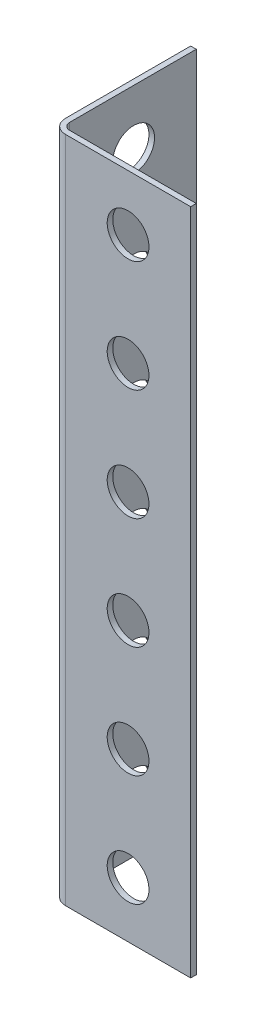
ISO-10303-21;
HEADER;
FILE_DESCRIPTION(('STEP AP214'),'2;1');
FILE_NAME('part.step','',(''),(''),'','','');
FILE_SCHEMA(('AUTOMOTIVE_DESIGN { 1 0 10303 214 1 1 1 1 }'));
ENDSEC;
DATA;
#1=APPLICATION_CONTEXT('core data for automotive mechanical design processes');
#2=APPLICATION_PROTOCOL_DEFINITION('international standard','automotive_design',2000,#1);
#3=PRODUCT_CONTEXT('',#1,'mechanical');
#4=PRODUCT('Part','Part','',(#3));
#5=PRODUCT_RELATED_PRODUCT_CATEGORY('part','',(#4));
#6=PRODUCT_DEFINITION_FORMATION('','',#4);
#7=PRODUCT_DEFINITION_CONTEXT('part definition',#1,'design');
#8=PRODUCT_DEFINITION('design','',#6,#7);
#9=PRODUCT_DEFINITION_SHAPE('','',#8);
#10=(LENGTH_UNIT() NAMED_UNIT(*) SI_UNIT(.MILLI.,.METRE.));
#11=(NAMED_UNIT(*) PLANE_ANGLE_UNIT() SI_UNIT($,.RADIAN.));
#12=(NAMED_UNIT(*) SI_UNIT($,.STERADIAN.) SOLID_ANGLE_UNIT());
#13=UNCERTAINTY_MEASURE_WITH_UNIT(LENGTH_MEASURE(1.E-05),#10,'distance_accuracy_value','');
#14=(GEOMETRIC_REPRESENTATION_CONTEXT(3) GLOBAL_UNCERTAINTY_ASSIGNED_CONTEXT((#13)) GLOBAL_UNIT_ASSIGNED_CONTEXT((#10,
#11,#12)) REPRESENTATION_CONTEXT('',''));
#15=CARTESIAN_POINT('',(0.,0.,0.));
#16=DIRECTION('',(0.,0.,1.));
#17=DIRECTION('',(1.,0.,0.));
#18=AXIS2_PLACEMENT_3D('',#15,#16,#17);
#19=CARTESIAN_POINT('',(0.,1219.2,-1.27));
#20=DIRECTION('',(0.,0.,-1.));
#21=DIRECTION('',(-1.,0.,0.));
#22=AXIS2_PLACEMENT_3D('',#19,#20,#21);
#23=PLANE('',#22);
#24=CARTESIAN_POINT('',(17.4625000000112,139.700000000001,-1.27));
#25=DIRECTION('',(0.,0.,-1.));
#26=DIRECTION('',(-1.,0.,0.));
#27=AXIS2_PLACEMENT_3D('',#24,#25,#26);
#28=CIRCLE('',#27,4.76250000000003);
#29=CARTESIAN_POINT('',(12.7000000000111,139.700000000001,-1.27));
#30=VERTEX_POINT('',#29);
#31=EDGE_CURVE('E176',#30,#30,#28,.F.);
#32=ORIENTED_EDGE('',*,*,#31,.T.);
#33=EDGE_LOOP('',(#32));
#34=FACE_BOUND('',#33,.T.);
#35=CARTESIAN_POINT('',(17.4625000000114,114.300000000001,-1.27));
#36=DIRECTION('',(0.,0.,-1.));
#37=DIRECTION('',(-1.,0.,0.));
#38=AXIS2_PLACEMENT_3D('',#35,#36,#37);
#39=CIRCLE('',#38,4.76250000000003);
#40=CARTESIAN_POINT('',(12.7000000000114,114.300000000001,-1.27));
#41=VERTEX_POINT('',#40);
#42=EDGE_CURVE('E170',#41,#41,#39,.F.);
#43=ORIENTED_EDGE('',*,*,#42,.T.);
#44=EDGE_LOOP('',(#43));
#45=FACE_BOUND('',#44,.T.);
#46=CARTESIAN_POINT('',(17.4625000000117,88.9000000000011,-1.27));
#47=DIRECTION('',(0.,0.,-1.));
#48=DIRECTION('',(-1.,0.,0.));
#49=AXIS2_PLACEMENT_3D('',#46,#47,#48);
#50=CIRCLE('',#49,4.76250000000003);
#51=CARTESIAN_POINT('',(12.7000000000117,88.9000000000011,-1.27));
#52=VERTEX_POINT('',#51);
#53=EDGE_CURVE('E164',#52,#52,#50,.F.);
#54=ORIENTED_EDGE('',*,*,#53,.T.);
#55=EDGE_LOOP('',(#54));
#56=FACE_BOUND('',#55,.T.);
#57=CARTESIAN_POINT('',(17.462500000012,63.5000000000012,-1.27));
#58=DIRECTION('',(0.,0.,-1.));
#59=DIRECTION('',(-1.,0.,0.));
#60=AXIS2_PLACEMENT_3D('',#57,#58,#59);
#61=CIRCLE('',#60,4.76250000000003);
#62=CARTESIAN_POINT('',(12.7000000000119,63.5000000000012,-1.27));
#63=VERTEX_POINT('',#62);
#64=EDGE_CURVE('E158',#63,#63,#61,.F.);
#65=ORIENTED_EDGE('',*,*,#64,.T.);
#66=EDGE_LOOP('',(#65));
#67=FACE_BOUND('',#66,.T.);
#68=CARTESIAN_POINT('',(17.4625000000122,38.1000000000011,-1.27));
#69=DIRECTION('',(0.,0.,-1.));
#70=DIRECTION('',(-1.,0.,0.));
#71=AXIS2_PLACEMENT_3D('',#68,#69,#70);
#72=CIRCLE('',#71,4.76250000000003);
#73=CARTESIAN_POINT('',(12.7000000000122,38.1000000000011,-1.27));
#74=VERTEX_POINT('',#73);
#75=EDGE_CURVE('E152',#74,#74,#72,.F.);
#76=ORIENTED_EDGE('',*,*,#75,.T.);
#77=EDGE_LOOP('',(#76));
#78=FACE_BOUND('',#77,.T.);
#79=CARTESIAN_POINT('',(17.4625000000125,12.700000000001,-1.27));
#80=DIRECTION('',(0.,0.,-1.));
#81=DIRECTION('',(-1.,0.,0.));
#82=AXIS2_PLACEMENT_3D('',#79,#80,#81);
#83=CIRCLE('',#82,4.76250000000003);
#84=CARTESIAN_POINT('',(12.7000000000125,12.700000000001,-1.27));
#85=VERTEX_POINT('',#84);
#86=EDGE_CURVE('E143',#85,#85,#83,.F.);
#87=ORIENTED_EDGE('',*,*,#86,.T.);
#88=EDGE_LOOP('',(#87));
#89=FACE_BOUND('',#88,.T.);
#90=DIRECTION('',(0.,-1.,0.));
#91=VECTOR('',#90,1.);
#92=CARTESIAN_POINT('',(2.8575,1219.2,-1.27));
#93=LINE('',#92,#91);
#94=CARTESIAN_POINT('',(2.8575,0.,-1.27));
#95=VERTEX_POINT('',#94);
#96=CARTESIAN_POINT('',(2.8575,152.4,-1.27));
#97=VERTEX_POINT('',#96);
#98=EDGE_CURVE('E40',#95,#97,#93,.F.);
#99=ORIENTED_EDGE('',*,*,#98,.T.);
#100=DIRECTION('',(-1.,0.,0.));
#101=VECTOR('',#100,1.);
#102=CARTESIAN_POINT('',(31.75,152.4,-1.27));
#103=LINE('',#102,#101);
#104=CARTESIAN_POINT('',(31.75,152.4,-1.27));
#105=VERTEX_POINT('',#104);
#106=EDGE_CURVE('E47',#105,#97,#103,.T.);
#107=ORIENTED_EDGE('',*,*,#106,.F.);
#108=DIRECTION('',(0.,-1.,0.));
#109=VECTOR('',#108,1.);
#110=CARTESIAN_POINT('',(31.75,1219.2,-1.27));
#111=LINE('',#110,#109);
#112=CARTESIAN_POINT('',(31.75,0.,-1.27));
#113=VERTEX_POINT('',#112);
#114=EDGE_CURVE('E125',#105,#113,#111,.T.);
#115=ORIENTED_EDGE('',*,*,#114,.T.);
#116=DIRECTION('',(1.,0.,0.));
#117=VECTOR('',#116,1.);
#118=CARTESIAN_POINT('',(0.,0.,-1.27));
#119=LINE('',#118,#117);
#120=EDGE_CURVE('E138',#95,#113,#119,.T.);
#121=ORIENTED_EDGE('',*,*,#120,.F.);
#122=EDGE_LOOP('',(#99,#107,#115,#121));
#123=FACE_BOUND('',#122,.T.);
#124=ADVANCED_FACE('F32',(#34,#45,#56,#67,#78,#89,#123),#23,.T.);
#125=CARTESIAN_POINT('',(1.27,1219.2,0.));
#126=DIRECTION('',(-1.,0.,0.));
#127=DIRECTION('',(0.,0.,1.));
#128=AXIS2_PLACEMENT_3D('',#125,#126,#127);
#129=PLANE('',#128);
#130=CARTESIAN_POINT('',(1.27,12.7,-17.4625));
#131=DIRECTION('',(-1.,0.,0.));
#132=DIRECTION('',(0.,0.,1.));
#133=AXIS2_PLACEMENT_3D('',#130,#131,#132);
#134=CIRCLE('',#133,4.7625);
#135=CARTESIAN_POINT('',(1.27,12.7,-12.7));
#136=VERTEX_POINT('',#135);
#137=EDGE_CURVE('E217',#136,#136,#134,.F.);
#138=ORIENTED_EDGE('',*,*,#137,.F.);
#139=EDGE_LOOP('',(#138));
#140=FACE_BOUND('',#139,.T.);
#141=CARTESIAN_POINT('',(1.27,38.1,-17.4625000000001));
#142=DIRECTION('',(-1.,0.,0.));
#143=DIRECTION('',(0.,0.,1.));
#144=AXIS2_PLACEMENT_3D('',#141,#142,#143);
#145=CIRCLE('',#144,4.7625);
#146=CARTESIAN_POINT('',(1.27,38.1,-12.7000000000001));
#147=VERTEX_POINT('',#146);
#148=EDGE_CURVE('E211',#147,#147,#145,.F.);
#149=ORIENTED_EDGE('',*,*,#148,.F.);
#150=EDGE_LOOP('',(#149));
#151=FACE_BOUND('',#150,.T.);
#152=CARTESIAN_POINT('',(1.27,63.5,-17.4625000000002));
#153=DIRECTION('',(-1.,0.,0.));
#154=DIRECTION('',(0.,0.,1.));
#155=AXIS2_PLACEMENT_3D('',#152,#153,#154);
#156=CIRCLE('',#155,4.7625);
#157=CARTESIAN_POINT('',(1.27,63.5,-12.7000000000002));
#158=VERTEX_POINT('',#157);
#159=EDGE_CURVE('E205',#158,#158,#156,.F.);
#160=ORIENTED_EDGE('',*,*,#159,.F.);
#161=EDGE_LOOP('',(#160));
#162=FACE_BOUND('',#161,.T.);
#163=CARTESIAN_POINT('',(1.27,88.9,-17.4625000000003));
#164=DIRECTION('',(-1.,0.,0.));
#165=DIRECTION('',(0.,0.,1.));
#166=AXIS2_PLACEMENT_3D('',#163,#164,#165);
#167=CIRCLE('',#166,4.7625);
#168=CARTESIAN_POINT('',(1.27,88.9,-12.7000000000003));
#169=VERTEX_POINT('',#168);
#170=EDGE_CURVE('E199',#169,#169,#167,.F.);
#171=ORIENTED_EDGE('',*,*,#170,.F.);
#172=EDGE_LOOP('',(#171));
#173=FACE_BOUND('',#172,.T.);
#174=CARTESIAN_POINT('',(1.27,114.3,-17.4625000000004));
#175=DIRECTION('',(-1.,0.,0.));
#176=DIRECTION('',(0.,0.,1.));
#177=AXIS2_PLACEMENT_3D('',#174,#175,#176);
#178=CIRCLE('',#177,4.7625);
#179=CARTESIAN_POINT('',(1.27,114.3,-12.7000000000003));
#180=VERTEX_POINT('',#179);
#181=EDGE_CURVE('E193',#180,#180,#178,.F.);
#182=ORIENTED_EDGE('',*,*,#181,.F.);
#183=EDGE_LOOP('',(#182));
#184=FACE_BOUND('',#183,.T.);
#185=CARTESIAN_POINT('',(1.27,139.7,-17.4625000000004));
#186=DIRECTION('',(-1.,0.,0.));
#187=DIRECTION('',(0.,0.,1.));
#188=AXIS2_PLACEMENT_3D('',#185,#186,#187);
#189=CIRCLE('',#188,4.7625);
#190=CARTESIAN_POINT('',(1.27,139.7,-12.7000000000004));
#191=VERTEX_POINT('',#190);
#192=EDGE_CURVE('E187',#191,#191,#189,.F.);
#193=ORIENTED_EDGE('',*,*,#192,.F.);
#194=EDGE_LOOP('',(#193));
#195=FACE_BOUND('',#194,.T.);
#196=DIRECTION('',(0.,0.,-1.));
#197=VECTOR('',#196,1.);
#198=CARTESIAN_POINT('',(1.27,152.4,-2.8575));
#199=LINE('',#198,#197);
#200=CARTESIAN_POINT('',(1.27,152.4,-2.8575));
#201=VERTEX_POINT('',#200);
#202=CARTESIAN_POINT('',(1.27,152.4,-31.75));
#203=VERTEX_POINT('',#202);
#204=EDGE_CURVE('E101',#201,#203,#199,.T.);
#205=ORIENTED_EDGE('',*,*,#204,.F.);
#206=DIRECTION('',(0.,-1.,0.));
#207=VECTOR('',#206,1.);
#208=CARTESIAN_POINT('',(1.27,1219.2,-2.8575));
#209=LINE('',#208,#207);
#210=CARTESIAN_POINT('',(1.27,0.,-2.8575));
#211=VERTEX_POINT('',#210);
#212=EDGE_CURVE('E133',#201,#211,#209,.T.);
#213=ORIENTED_EDGE('',*,*,#212,.T.);
#214=DIRECTION('',(0.,0.,-1.));
#215=VECTOR('',#214,1.);
#216=CARTESIAN_POINT('',(1.27,0.,0.));
#217=LINE('',#216,#215);
#218=CARTESIAN_POINT('',(1.27,0.,-31.75));
#219=VERTEX_POINT('',#218);
#220=EDGE_CURVE('E221',#211,#219,#217,.T.);
#221=ORIENTED_EDGE('',*,*,#220,.T.);
#222=DIRECTION('',(0.,-1.,0.));
#223=VECTOR('',#222,1.);
#224=CARTESIAN_POINT('',(1.27,1219.2,-31.75));
#225=LINE('',#224,#223);
#226=EDGE_CURVE('E120',#203,#219,#225,.T.);
#227=ORIENTED_EDGE('',*,*,#226,.F.);
#228=EDGE_LOOP('',(#205,#213,#221,#227));
#229=FACE_BOUND('',#228,.T.);
#230=ADVANCED_FACE('F257',(#140,#151,#162,#173,#184,#195,#229),#129,.F.);
#231=CARTESIAN_POINT('',(0.,1219.2,-31.75));
#232=DIRECTION('',(0.,0.,-1.));
#233=DIRECTION('',(-1.,0.,0.));
#234=AXIS2_PLACEMENT_3D('',#231,#232,#233);
#235=PLANE('',#234);
#236=DIRECTION('',(0.,-1.,0.));
#237=VECTOR('',#236,1.);
#238=CARTESIAN_POINT('',(0.,1219.2,-31.75));
#239=LINE('',#238,#237);
#240=CARTESIAN_POINT('',(0.,152.4,-31.75));
#241=VERTEX_POINT('',#240);
#242=CARTESIAN_POINT('',(0.,0.,-31.75));
#243=VERTEX_POINT('',#242);
#244=EDGE_CURVE('E110',#241,#243,#239,.T.);
#245=ORIENTED_EDGE('',*,*,#244,.F.);
#246=DIRECTION('',(-1.,0.,0.));
#247=VECTOR('',#246,1.);
#248=CARTESIAN_POINT('',(1.27,152.4,-31.75));
#249=LINE('',#248,#247);
#250=EDGE_CURVE('E95',#203,#241,#249,.T.);
#251=ORIENTED_EDGE('',*,*,#250,.F.);
#252=ORIENTED_EDGE('',*,*,#226,.T.);
#253=DIRECTION('',(1.,0.,0.));
#254=VECTOR('',#253,1.);
#255=CARTESIAN_POINT('',(0.,0.,-31.75));
#256=LINE('',#255,#254);
#257=EDGE_CURVE('E119',#243,#219,#256,.T.);
#258=ORIENTED_EDGE('',*,*,#257,.F.);
#259=EDGE_LOOP('',(#245,#251,#252,#258));
#260=FACE_BOUND('',#259,.T.);
#261=ADVANCED_FACE('F117',(#260),#235,.T.);
#262=CARTESIAN_POINT('',(0.,1219.2,0.));
#263=DIRECTION('',(-1.,0.,0.));
#264=DIRECTION('',(0.,0.,1.));
#265=AXIS2_PLACEMENT_3D('',#262,#263,#264);
#266=PLANE('',#265);
#267=CARTESIAN_POINT('',(0.,12.7,-17.4625));
#268=DIRECTION('',(-1.,0.,0.));
#269=DIRECTION('',(0.,0.,1.));
#270=AXIS2_PLACEMENT_3D('',#267,#268,#269);
#271=CIRCLE('',#270,4.7625);
#272=CARTESIAN_POINT('',(0.,12.7,-12.7));
#273=VERTEX_POINT('',#272);
#274=EDGE_CURVE('E214',#273,#273,#271,.T.);
#275=ORIENTED_EDGE('',*,*,#274,.F.);
#276=EDGE_LOOP('',(#275));
#277=FACE_BOUND('',#276,.T.);
#278=CARTESIAN_POINT('',(0.,38.1,-17.4625000000001));
#279=DIRECTION('',(-1.,0.,0.));
#280=DIRECTION('',(0.,0.,1.));
#281=AXIS2_PLACEMENT_3D('',#278,#279,#280);
#282=CIRCLE('',#281,4.7625);
#283=CARTESIAN_POINT('',(0.,38.1,-12.7000000000001));
#284=VERTEX_POINT('',#283);
#285=EDGE_CURVE('E208',#284,#284,#282,.T.);
#286=ORIENTED_EDGE('',*,*,#285,.F.);
#287=EDGE_LOOP('',(#286));
#288=FACE_BOUND('',#287,.T.);
#289=CARTESIAN_POINT('',(0.,63.5,-17.4625000000002));
#290=DIRECTION('',(-1.,0.,0.));
#291=DIRECTION('',(0.,0.,1.));
#292=AXIS2_PLACEMENT_3D('',#289,#290,#291);
#293=CIRCLE('',#292,4.7625);
#294=CARTESIAN_POINT('',(0.,63.5,-12.7000000000002));
#295=VERTEX_POINT('',#294);
#296=EDGE_CURVE('E202',#295,#295,#293,.T.);
#297=ORIENTED_EDGE('',*,*,#296,.F.);
#298=EDGE_LOOP('',(#297));
#299=FACE_BOUND('',#298,.T.);
#300=CARTESIAN_POINT('',(0.,88.9,-17.4625000000003));
#301=DIRECTION('',(-1.,0.,0.));
#302=DIRECTION('',(0.,0.,1.));
#303=AXIS2_PLACEMENT_3D('',#300,#301,#302);
#304=CIRCLE('',#303,4.7625);
#305=CARTESIAN_POINT('',(0.,88.9,-12.7000000000003));
#306=VERTEX_POINT('',#305);
#307=EDGE_CURVE('E196',#306,#306,#304,.T.);
#308=ORIENTED_EDGE('',*,*,#307,.F.);
#309=EDGE_LOOP('',(#308));
#310=FACE_BOUND('',#309,.T.);
#311=CARTESIAN_POINT('',(0.,114.3,-17.4625000000004));
#312=DIRECTION('',(-1.,0.,0.));
#313=DIRECTION('',(0.,0.,1.));
#314=AXIS2_PLACEMENT_3D('',#311,#312,#313);
#315=CIRCLE('',#314,4.7625);
#316=CARTESIAN_POINT('',(0.,114.3,-12.7000000000003));
#317=VERTEX_POINT('',#316);
#318=EDGE_CURVE('E190',#317,#317,#315,.T.);
#319=ORIENTED_EDGE('',*,*,#318,.F.);
#320=EDGE_LOOP('',(#319));
#321=FACE_BOUND('',#320,.T.);
#322=CARTESIAN_POINT('',(0.,139.7,-17.4625000000004));
#323=DIRECTION('',(-1.,0.,0.));
#324=DIRECTION('',(0.,0.,1.));
#325=AXIS2_PLACEMENT_3D('',#322,#323,#324);
#326=CIRCLE('',#325,4.7625);
#327=CARTESIAN_POINT('',(0.,139.7,-12.7000000000004));
#328=VERTEX_POINT('',#327);
#329=EDGE_CURVE('E182',#328,#328,#326,.T.);
#330=ORIENTED_EDGE('',*,*,#329,.F.);
#331=EDGE_LOOP('',(#330));
#332=FACE_BOUND('',#331,.T.);
#333=DIRECTION('',(0.,-1.,0.));
#334=VECTOR('',#333,1.);
#335=CARTESIAN_POINT('',(0.,1219.2,-3.175));
#336=LINE('',#335,#334);
#337=CARTESIAN_POINT('',(0.,0.,-3.175));
#338=VERTEX_POINT('',#337);
#339=CARTESIAN_POINT('',(0.,152.4,-3.175));
#340=VERTEX_POINT('',#339);
#341=EDGE_CURVE('E113',#338,#340,#336,.F.);
#342=ORIENTED_EDGE('',*,*,#341,.T.);
#343=DIRECTION('',(0.,0.,1.));
#344=VECTOR('',#343,1.);
#345=CARTESIAN_POINT('',(0.,152.4,-31.75));
#346=LINE('',#345,#344);
#347=EDGE_CURVE('E98',#241,#340,#346,.T.);
#348=ORIENTED_EDGE('',*,*,#347,.F.);
#349=ORIENTED_EDGE('',*,*,#244,.T.);
#350=DIRECTION('',(0.,0.,-1.));
#351=VECTOR('',#350,1.);
#352=CARTESIAN_POINT('',(0.,0.,0.));
#353=LINE('',#352,#351);
#354=EDGE_CURVE('E225',#338,#243,#353,.T.);
#355=ORIENTED_EDGE('',*,*,#354,.F.);
#356=EDGE_LOOP('',(#342,#348,#349,#355));
#357=FACE_BOUND('',#356,.T.);
#358=ADVANCED_FACE('F108',(#277,#288,#299,#310,#321,#332,#357),#266,.T.);
#359=CARTESIAN_POINT('',(0.,1219.2,0.));
#360=DIRECTION('',(0.,0.,-1.));
#361=DIRECTION('',(-1.,0.,0.));
#362=AXIS2_PLACEMENT_3D('',#359,#360,#361);
#363=PLANE('',#362);
#364=CARTESIAN_POINT('',(17.4625000000112,139.700000000001,0.));
#365=DIRECTION('',(0.,0.,1.));
#366=DIRECTION('',(1.,0.,0.));
#367=AXIS2_PLACEMENT_3D('',#364,#365,#366);
#368=CIRCLE('',#367,4.76250000000003);
#369=CARTESIAN_POINT('',(22.2250000000112,139.700000000001,0.));
#370=VERTEX_POINT('',#369);
#371=EDGE_CURVE('E179',#370,#370,#368,.T.);
#372=ORIENTED_EDGE('',*,*,#371,.F.);
#373=EDGE_LOOP('',(#372));
#374=FACE_BOUND('',#373,.T.);
#375=CARTESIAN_POINT('',(17.4625000000114,114.300000000001,0.));
#376=DIRECTION('',(0.,0.,1.));
#377=DIRECTION('',(1.,0.,0.));
#378=AXIS2_PLACEMENT_3D('',#375,#376,#377);
#379=CIRCLE('',#378,4.76250000000003);
#380=CARTESIAN_POINT('',(22.2250000000115,114.300000000001,0.));
#381=VERTEX_POINT('',#380);
#382=EDGE_CURVE('E173',#381,#381,#379,.T.);
#383=ORIENTED_EDGE('',*,*,#382,.F.);
#384=EDGE_LOOP('',(#383));
#385=FACE_BOUND('',#384,.T.);
#386=CARTESIAN_POINT('',(17.4625000000117,88.9000000000011,0.));
#387=DIRECTION('',(0.,0.,1.));
#388=DIRECTION('',(1.,0.,0.));
#389=AXIS2_PLACEMENT_3D('',#386,#387,#388);
#390=CIRCLE('',#389,4.76250000000003);
#391=CARTESIAN_POINT('',(22.2250000000117,88.9000000000011,0.));
#392=VERTEX_POINT('',#391);
#393=EDGE_CURVE('E167',#392,#392,#390,.T.);
#394=ORIENTED_EDGE('',*,*,#393,.F.);
#395=EDGE_LOOP('',(#394));
#396=FACE_BOUND('',#395,.T.);
#397=CARTESIAN_POINT('',(17.462500000012,63.5000000000012,0.));
#398=DIRECTION('',(0.,0.,1.));
#399=DIRECTION('',(1.,0.,0.));
#400=AXIS2_PLACEMENT_3D('',#397,#398,#399);
#401=CIRCLE('',#400,4.76250000000003);
#402=CARTESIAN_POINT('',(22.225000000012,63.5000000000012,0.));
#403=VERTEX_POINT('',#402);
#404=EDGE_CURVE('E161',#403,#403,#401,.T.);
#405=ORIENTED_EDGE('',*,*,#404,.F.);
#406=EDGE_LOOP('',(#405));
#407=FACE_BOUND('',#406,.T.);
#408=CARTESIAN_POINT('',(17.4625000000122,38.1000000000011,0.));
#409=DIRECTION('',(0.,0.,1.));
#410=DIRECTION('',(1.,0.,0.));
#411=AXIS2_PLACEMENT_3D('',#408,#409,#410);
#412=CIRCLE('',#411,4.76250000000003);
#413=CARTESIAN_POINT('',(22.2250000000123,38.1000000000011,0.));
#414=VERTEX_POINT('',#413);
#415=EDGE_CURVE('E155',#414,#414,#412,.T.);
#416=ORIENTED_EDGE('',*,*,#415,.F.);
#417=EDGE_LOOP('',(#416));
#418=FACE_BOUND('',#417,.T.);
#419=CARTESIAN_POINT('',(17.4625000000125,12.700000000001,0.));
#420=DIRECTION('',(0.,0.,1.));
#421=DIRECTION('',(1.,0.,0.));
#422=AXIS2_PLACEMENT_3D('',#419,#420,#421);
#423=CIRCLE('',#422,4.76250000000003);
#424=CARTESIAN_POINT('',(22.2250000000125,12.700000000001,0.));
#425=VERTEX_POINT('',#424);
#426=EDGE_CURVE('E149',#425,#425,#423,.T.);
#427=ORIENTED_EDGE('',*,*,#426,.F.);
#428=EDGE_LOOP('',(#427));
#429=FACE_BOUND('',#428,.T.);
#430=DIRECTION('',(1.,0.,0.));
#431=VECTOR('',#430,1.);
#432=CARTESIAN_POINT('',(3.175,152.4,0.));
#433=LINE('',#432,#431);
#434=CARTESIAN_POINT('',(3.175,152.4,0.));
#435=VERTEX_POINT('',#434);
#436=CARTESIAN_POINT('',(31.75,152.4,0.));
#437=VERTEX_POINT('',#436);
#438=EDGE_CURVE('E246',#435,#437,#433,.T.);
#439=ORIENTED_EDGE('',*,*,#438,.F.);
#440=DIRECTION('',(0.,-1.,0.));
#441=VECTOR('',#440,1.);
#442=CARTESIAN_POINT('',(3.175,0.,0.));
#443=LINE('',#442,#441);
#444=CARTESIAN_POINT('',(3.175,0.,0.));
#445=VERTEX_POINT('',#444);
#446=EDGE_CURVE('E123',#435,#445,#443,.T.);
#447=ORIENTED_EDGE('',*,*,#446,.T.);
#448=DIRECTION('',(1.,0.,0.));
#449=VECTOR('',#448,1.);
#450=CARTESIAN_POINT('',(0.,0.,0.));
#451=LINE('',#450,#449);
#452=CARTESIAN_POINT('',(31.75,0.,0.));
#453=VERTEX_POINT('',#452);
#454=EDGE_CURVE('E227',#445,#453,#451,.T.);
#455=ORIENTED_EDGE('',*,*,#454,.T.);
#456=DIRECTION('',(0.,-1.,0.));
#457=VECTOR('',#456,1.);
#458=CARTESIAN_POINT('',(31.75,1219.2,0.));
#459=LINE('',#458,#457);
#460=EDGE_CURVE('E121',#437,#453,#459,.T.);
#461=ORIENTED_EDGE('',*,*,#460,.F.);
#462=EDGE_LOOP('',(#439,#447,#455,#461));
#463=FACE_BOUND('',#462,.T.);
#464=ADVANCED_FACE('F241',(#374,#385,#396,#407,#418,#429,#463),#363,.F.);
#465=CARTESIAN_POINT('',(31.75,1219.2,0.));
#466=DIRECTION('',(-1.,0.,0.));
#467=DIRECTION('',(0.,0.,1.));
#468=AXIS2_PLACEMENT_3D('',#465,#466,#467);
#469=PLANE('',#468);
#470=DIRECTION('',(0.,0.,-1.));
#471=VECTOR('',#470,1.);
#472=CARTESIAN_POINT('',(31.75,152.4,0.));
#473=LINE('',#472,#471);
#474=EDGE_CURVE('E145',#437,#105,#473,.T.);
#475=ORIENTED_EDGE('',*,*,#474,.F.);
#476=ORIENTED_EDGE('',*,*,#460,.T.);
#477=DIRECTION('',(0.,0.,-1.));
#478=VECTOR('',#477,1.);
#479=CARTESIAN_POINT('',(31.75,0.,0.));
#480=LINE('',#479,#478);
#481=EDGE_CURVE('E230',#453,#113,#480,.T.);
#482=ORIENTED_EDGE('',*,*,#481,.T.);
#483=ORIENTED_EDGE('',*,*,#114,.F.);
#484=EDGE_LOOP('',(#475,#476,#482,#483));
#485=FACE_BOUND('',#484,.T.);
#486=ADVANCED_FACE('F237',(#485),#469,.F.);
#487=CARTESIAN_POINT('',(3.175,1219.2,-3.175));
#488=DIRECTION('',(0.,1.,0.));
#489=DIRECTION('',(0.,0.,1.));
#490=AXIS2_PLACEMENT_3D('',#487,#488,#489);
#491=CYLINDRICAL_SURFACE('',#490,3.175);
#492=ORIENTED_EDGE('',*,*,#446,.F.);
#493=CARTESIAN_POINT('',(3.175,152.4,-3.175));
#494=DIRECTION('',(0.,1.,0.));
#495=DIRECTION('',(0.,0.,1.));
#496=AXIS2_PLACEMENT_3D('',#493,#494,#495);
#497=CIRCLE('',#496,3.175);
#498=EDGE_CURVE('E114',#340,#435,#497,.T.);
#499=ORIENTED_EDGE('',*,*,#498,.F.);
#500=ORIENTED_EDGE('',*,*,#341,.F.);
#501=CARTESIAN_POINT('',(3.175,0.,-3.175));
#502=DIRECTION('',(0.,1.,0.));
#503=DIRECTION('',(0.,0.,1.));
#504=AXIS2_PLACEMENT_3D('',#501,#502,#503);
#505=CIRCLE('',#504,3.175);
#506=EDGE_CURVE('E130',#445,#338,#505,.F.);
#507=ORIENTED_EDGE('',*,*,#506,.F.);
#508=EDGE_LOOP('',(#492,#499,#500,#507));
#509=FACE_BOUND('',#508,.T.);
#510=ADVANCED_FACE('F245',(#509),#491,.T.);
#511=CARTESIAN_POINT('',(2.8575,1219.2,-2.8575));
#512=DIRECTION('',(0.,-1.,0.));
#513=DIRECTION('',(0.,0.,-1.));
#514=AXIS2_PLACEMENT_3D('',#511,#512,#513);
#515=CYLINDRICAL_SURFACE('',#514,1.5875);
#516=CARTESIAN_POINT('',(2.8575,152.4,-2.8575));
#517=DIRECTION('',(0.,-1.,0.));
#518=DIRECTION('',(0.,0.,1.));
#519=AXIS2_PLACEMENT_3D('',#516,#517,#518);
#520=CIRCLE('',#519,1.5875);
#521=EDGE_CURVE('E141',#97,#201,#520,.T.);
#522=ORIENTED_EDGE('',*,*,#521,.F.);
#523=ORIENTED_EDGE('',*,*,#98,.F.);
#524=CARTESIAN_POINT('',(2.8575,0.,-2.8575));
#525=DIRECTION('',(0.,1.,0.));
#526=DIRECTION('',(0.,0.,1.));
#527=AXIS2_PLACEMENT_3D('',#524,#525,#526);
#528=CIRCLE('',#527,1.5875);
#529=EDGE_CURVE('E11',#211,#95,#528,.T.);
#530=ORIENTED_EDGE('',*,*,#529,.F.);
#531=ORIENTED_EDGE('',*,*,#212,.F.);
#532=EDGE_LOOP('',(#522,#523,#530,#531));
#533=FACE_BOUND('',#532,.T.);
#534=ADVANCED_FACE('F34',(#533),#515,.F.);
#535=CARTESIAN_POINT('',(0.,0.,0.));
#536=DIRECTION('',(0.,1.,0.));
#537=DIRECTION('',(0.,0.,1.));
#538=AXIS2_PLACEMENT_3D('',#535,#536,#537);
#539=PLANE('',#538);
#540=ORIENTED_EDGE('',*,*,#454,.F.);
#541=ORIENTED_EDGE('',*,*,#506,.T.);
#542=ORIENTED_EDGE('',*,*,#354,.T.);
#543=ORIENTED_EDGE('',*,*,#257,.T.);
#544=ORIENTED_EDGE('',*,*,#220,.F.);
#545=ORIENTED_EDGE('',*,*,#529,.T.);
#546=ORIENTED_EDGE('',*,*,#120,.T.);
#547=ORIENTED_EDGE('',*,*,#481,.F.);
#548=EDGE_LOOP('',(#540,#541,#542,#543,#544,#545,#546,#547));
#549=FACE_BOUND('',#548,.T.);
#550=ADVANCED_FACE('F236',(#549),#539,.F.);
#551=CARTESIAN_POINT('',(31.751,12.7,-17.4625));
#552=DIRECTION('',(-1.,0.,0.));
#553=DIRECTION('',(0.,0.,1.));
#554=AXIS2_PLACEMENT_3D('',#551,#552,#553);
#555=CYLINDRICAL_SURFACE('',#554,4.7625);
#556=ORIENTED_EDGE('',*,*,#274,.T.);
#557=EDGE_LOOP('',(#556));
#558=FACE_BOUND('',#557,.T.);
#559=ORIENTED_EDGE('',*,*,#137,.T.);
#560=EDGE_LOOP('',(#559));
#561=FACE_BOUND('',#560,.T.);
#562=ADVANCED_FACE('F276',(#558,#561),#555,.F.);
#563=CARTESIAN_POINT('',(31.751,38.1,-17.4625000000001));
#564=DIRECTION('',(-1.,0.,0.));
#565=DIRECTION('',(0.,0.,1.));
#566=AXIS2_PLACEMENT_3D('',#563,#564,#565);
#567=CYLINDRICAL_SURFACE('',#566,4.7625);
#568=ORIENTED_EDGE('',*,*,#285,.T.);
#569=EDGE_LOOP('',(#568));
#570=FACE_BOUND('',#569,.T.);
#571=ORIENTED_EDGE('',*,*,#148,.T.);
#572=EDGE_LOOP('',(#571));
#573=FACE_BOUND('',#572,.T.);
#574=ADVANCED_FACE('F279',(#570,#573),#567,.F.);
#575=CARTESIAN_POINT('',(31.751,63.5,-17.4625000000002));
#576=DIRECTION('',(-1.,0.,0.));
#577=DIRECTION('',(0.,0.,1.));
#578=AXIS2_PLACEMENT_3D('',#575,#576,#577);
#579=CYLINDRICAL_SURFACE('',#578,4.7625);
#580=ORIENTED_EDGE('',*,*,#296,.T.);
#581=EDGE_LOOP('',(#580));
#582=FACE_BOUND('',#581,.T.);
#583=ORIENTED_EDGE('',*,*,#159,.T.);
#584=EDGE_LOOP('',(#583));
#585=FACE_BOUND('',#584,.T.);
#586=ADVANCED_FACE('F283',(#582,#585),#579,.F.);
#587=CARTESIAN_POINT('',(31.751,88.9,-17.4625000000003));
#588=DIRECTION('',(-1.,0.,0.));
#589=DIRECTION('',(0.,0.,1.));
#590=AXIS2_PLACEMENT_3D('',#587,#588,#589);
#591=CYLINDRICAL_SURFACE('',#590,4.7625);
#592=ORIENTED_EDGE('',*,*,#307,.T.);
#593=EDGE_LOOP('',(#592));
#594=FACE_BOUND('',#593,.T.);
#595=ORIENTED_EDGE('',*,*,#170,.T.);
#596=EDGE_LOOP('',(#595));
#597=FACE_BOUND('',#596,.T.);
#598=ADVANCED_FACE('F287',(#594,#597),#591,.F.);
#599=CARTESIAN_POINT('',(31.751,114.3,-17.4625000000004));
#600=DIRECTION('',(-1.,0.,0.));
#601=DIRECTION('',(0.,0.,1.));
#602=AXIS2_PLACEMENT_3D('',#599,#600,#601);
#603=CYLINDRICAL_SURFACE('',#602,4.7625);
#604=ORIENTED_EDGE('',*,*,#318,.T.);
#605=EDGE_LOOP('',(#604));
#606=FACE_BOUND('',#605,.T.);
#607=ORIENTED_EDGE('',*,*,#181,.T.);
#608=EDGE_LOOP('',(#607));
#609=FACE_BOUND('',#608,.T.);
#610=ADVANCED_FACE('F291',(#606,#609),#603,.F.);
#611=CARTESIAN_POINT('',(31.751,139.7,-17.4625000000004));
#612=DIRECTION('',(-1.,0.,0.));
#613=DIRECTION('',(0.,0.,1.));
#614=AXIS2_PLACEMENT_3D('',#611,#612,#613);
#615=CYLINDRICAL_SURFACE('',#614,4.7625);
#616=ORIENTED_EDGE('',*,*,#329,.T.);
#617=EDGE_LOOP('',(#616));
#618=FACE_BOUND('',#617,.T.);
#619=ORIENTED_EDGE('',*,*,#192,.T.);
#620=EDGE_LOOP('',(#619));
#621=FACE_BOUND('',#620,.T.);
#622=ADVANCED_FACE('F295',(#618,#621),#615,.F.);
#623=CARTESIAN_POINT('',(17.4625000000112,139.700000000001,-31.751));
#624=DIRECTION('',(0.,0.,1.));
#625=DIRECTION('',(1.,0.,0.));
#626=AXIS2_PLACEMENT_3D('',#623,#624,#625);
#627=CYLINDRICAL_SURFACE('',#626,4.76250000000003);
#628=ORIENTED_EDGE('',*,*,#31,.F.);
#629=EDGE_LOOP('',(#628));
#630=FACE_BOUND('',#629,.T.);
#631=ORIENTED_EDGE('',*,*,#371,.T.);
#632=EDGE_LOOP('',(#631));
#633=FACE_BOUND('',#632,.T.);
#634=ADVANCED_FACE('F299',(#630,#633),#627,.F.);
#635=CARTESIAN_POINT('',(17.4625000000114,114.300000000001,-31.751));
#636=DIRECTION('',(0.,0.,1.));
#637=DIRECTION('',(1.,0.,0.));
#638=AXIS2_PLACEMENT_3D('',#635,#636,#637);
#639=CYLINDRICAL_SURFACE('',#638,4.76250000000003);
#640=ORIENTED_EDGE('',*,*,#42,.F.);
#641=EDGE_LOOP('',(#640));
#642=FACE_BOUND('',#641,.T.);
#643=ORIENTED_EDGE('',*,*,#382,.T.);
#644=EDGE_LOOP('',(#643));
#645=FACE_BOUND('',#644,.T.);
#646=ADVANCED_FACE('F303',(#642,#645),#639,.F.);
#647=CARTESIAN_POINT('',(17.4625000000117,88.9000000000011,-31.751));
#648=DIRECTION('',(0.,0.,1.));
#649=DIRECTION('',(1.,0.,0.));
#650=AXIS2_PLACEMENT_3D('',#647,#648,#649);
#651=CYLINDRICAL_SURFACE('',#650,4.76250000000003);
#652=ORIENTED_EDGE('',*,*,#53,.F.);
#653=EDGE_LOOP('',(#652));
#654=FACE_BOUND('',#653,.T.);
#655=ORIENTED_EDGE('',*,*,#393,.T.);
#656=EDGE_LOOP('',(#655));
#657=FACE_BOUND('',#656,.T.);
#658=ADVANCED_FACE('F307',(#654,#657),#651,.F.);
#659=CARTESIAN_POINT('',(17.462500000012,63.5000000000012,-31.751));
#660=DIRECTION('',(0.,0.,1.));
#661=DIRECTION('',(1.,0.,0.));
#662=AXIS2_PLACEMENT_3D('',#659,#660,#661);
#663=CYLINDRICAL_SURFACE('',#662,4.76250000000003);
#664=ORIENTED_EDGE('',*,*,#64,.F.);
#665=EDGE_LOOP('',(#664));
#666=FACE_BOUND('',#665,.T.);
#667=ORIENTED_EDGE('',*,*,#404,.T.);
#668=EDGE_LOOP('',(#667));
#669=FACE_BOUND('',#668,.T.);
#670=ADVANCED_FACE('F311',(#666,#669),#663,.F.);
#671=CARTESIAN_POINT('',(17.4625000000122,38.1000000000011,-31.751));
#672=DIRECTION('',(0.,0.,1.));
#673=DIRECTION('',(1.,0.,0.));
#674=AXIS2_PLACEMENT_3D('',#671,#672,#673);
#675=CYLINDRICAL_SURFACE('',#674,4.76250000000003);
#676=ORIENTED_EDGE('',*,*,#75,.F.);
#677=EDGE_LOOP('',(#676));
#678=FACE_BOUND('',#677,.T.);
#679=ORIENTED_EDGE('',*,*,#415,.T.);
#680=EDGE_LOOP('',(#679));
#681=FACE_BOUND('',#680,.T.);
#682=ADVANCED_FACE('F315',(#678,#681),#675,.F.);
#683=CARTESIAN_POINT('',(17.4625000000125,12.700000000001,-31.751));
#684=DIRECTION('',(0.,0.,1.));
#685=DIRECTION('',(1.,0.,0.));
#686=AXIS2_PLACEMENT_3D('',#683,#684,#685);
#687=CYLINDRICAL_SURFACE('',#686,4.76250000000003);
#688=ORIENTED_EDGE('',*,*,#86,.F.);
#689=EDGE_LOOP('',(#688));
#690=FACE_BOUND('',#689,.T.);
#691=ORIENTED_EDGE('',*,*,#426,.T.);
#692=EDGE_LOOP('',(#691));
#693=FACE_BOUND('',#692,.T.);
#694=ADVANCED_FACE('F319',(#690,#693),#687,.F.);
#695=CARTESIAN_POINT('',(3.175,152.4,-3.175));
#696=DIRECTION('',(0.,1.,0.));
#697=DIRECTION('',(0.,0.,1.));
#698=AXIS2_PLACEMENT_3D('',#695,#696,#697);
#699=PLANE('',#698);
#700=ORIENTED_EDGE('',*,*,#250,.T.);
#701=ORIENTED_EDGE('',*,*,#347,.T.);
#702=ORIENTED_EDGE('',*,*,#498,.T.);
#703=ORIENTED_EDGE('',*,*,#438,.T.);
#704=ORIENTED_EDGE('',*,*,#474,.T.);
#705=ORIENTED_EDGE('',*,*,#106,.T.);
#706=ORIENTED_EDGE('',*,*,#521,.T.);
#707=ORIENTED_EDGE('',*,*,#204,.T.);
#708=EDGE_LOOP('',(#700,#701,#702,#703,#704,#705,#706,#707));
#709=FACE_BOUND('',#708,.T.);
#710=ADVANCED_FACE('F97',(#709),#699,.T.);
#711=CLOSED_SHELL('',(#124,#230,#261,#358,#464,#486,#510,#534,#550,#562,#574,#586,#598,#610,
#622,#634,#646,#658,#670,#682,#694,#710));
#712=MANIFOLD_SOLID_BREP('B2',#711);
#713=ADVANCED_BREP_SHAPE_REPRESENTATION('',(#18,#712),#14);
#714=SHAPE_DEFINITION_REPRESENTATION(#9,#713);
ENDSEC;
END-ISO-10303-21;
